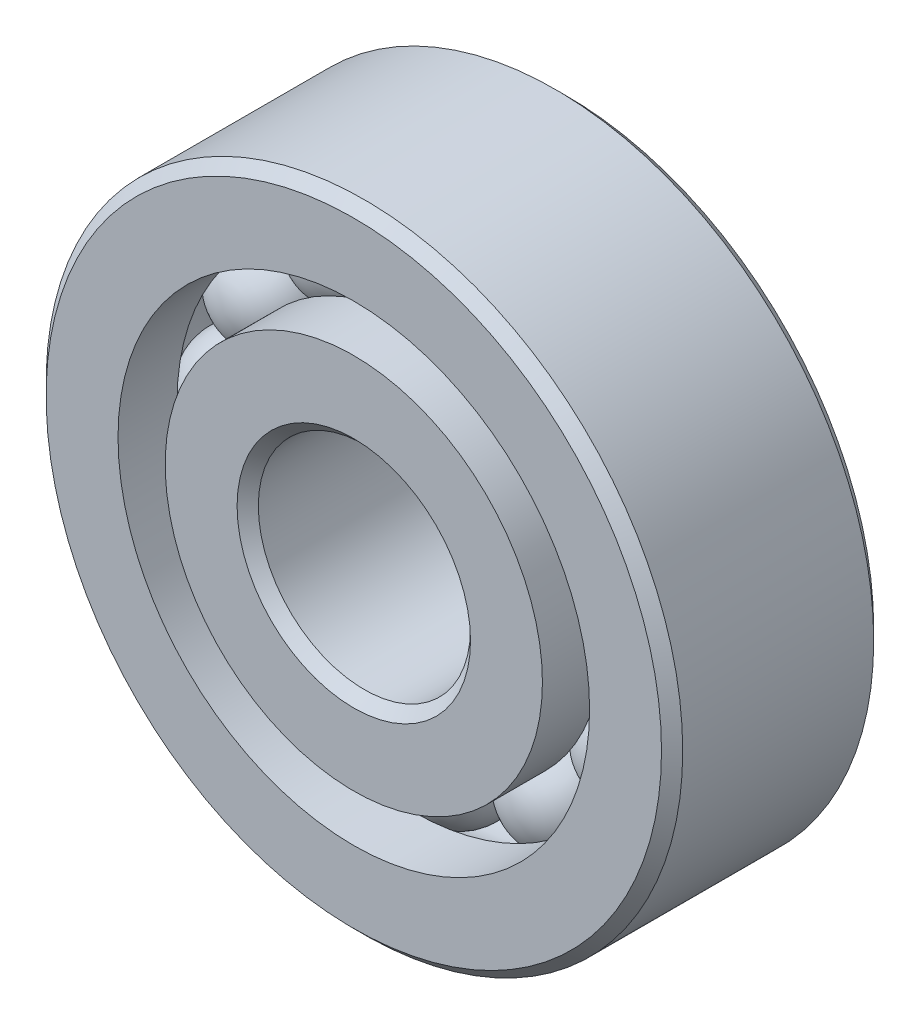
ISO-10303-21;
HEADER;
FILE_DESCRIPTION(('STEP AP214'),'2;1');
FILE_NAME('part.step','',(''),(''),'','','');
FILE_SCHEMA(('AUTOMOTIVE_DESIGN { 1 0 10303 214 1 1 1 1 }'));
ENDSEC;
DATA;
#1=APPLICATION_CONTEXT('core data for automotive mechanical design processes');
#2=APPLICATION_PROTOCOL_DEFINITION('international standard','automotive_design',2000,#1);
#3=PRODUCT_CONTEXT('',#1,'mechanical');
#4=PRODUCT('Part','Part','',(#3));
#5=PRODUCT_RELATED_PRODUCT_CATEGORY('part','',(#4));
#6=PRODUCT_DEFINITION_FORMATION('','',#4);
#7=PRODUCT_DEFINITION_CONTEXT('part definition',#1,'design');
#8=PRODUCT_DEFINITION('design','',#6,#7);
#9=PRODUCT_DEFINITION_SHAPE('','',#8);
#10=(LENGTH_UNIT() NAMED_UNIT(*) SI_UNIT(.MILLI.,.METRE.));
#11=(NAMED_UNIT(*) PLANE_ANGLE_UNIT() SI_UNIT($,.RADIAN.));
#12=(NAMED_UNIT(*) SI_UNIT($,.STERADIAN.) SOLID_ANGLE_UNIT());
#13=UNCERTAINTY_MEASURE_WITH_UNIT(LENGTH_MEASURE(1.E-05),#10,'distance_accuracy_value','');
#14=(GEOMETRIC_REPRESENTATION_CONTEXT(3) GLOBAL_UNCERTAINTY_ASSIGNED_CONTEXT((#13)) GLOBAL_UNIT_ASSIGNED_CONTEXT((#10,
#11,#12)) REPRESENTATION_CONTEXT('',''));
#15=CARTESIAN_POINT('',(0.,0.,0.));
#16=DIRECTION('',(0.,0.,1.));
#17=DIRECTION('',(1.,0.,0.));
#18=AXIS2_PLACEMENT_3D('',#15,#16,#17);
#19=CARTESIAN_POINT('',(-0.499999999999989,0.866025403784445,0.));
#20=DIRECTION('',(0.,0.,1.));
#21=DIRECTION('',(-0.499999999999989,0.866025403784445,0.));
#22=AXIS2_PLACEMENT_3D('',#19,#20,#21);
#23=SPHERICAL_SURFACE('',#22,0.248451997499976);
#24=CARTESIAN_POINT('',(-0.499999999999989,0.866025403784445,0.248451997499976));
#25=VERTEX_POINT('',#24);
#26=VERTEX_LOOP('',#25);
#27=FACE_BOUND('',#26,.T.);
#28=ADVANCED_FACE('F41',(#27),#23,.T.);
#29=CLOSED_SHELL('',(#28));
#30=MANIFOLD_SOLID_BREP('B2',#29);
#31=CARTESIAN_POINT('',(-0.866025403784433,0.50000000000001,0.));
#32=DIRECTION('',(0.,0.,1.));
#33=DIRECTION('',(-0.866025403784433,0.50000000000001,0.));
#34=AXIS2_PLACEMENT_3D('',#31,#32,#33);
#35=SPHERICAL_SURFACE('',#34,0.248451997499976);
#36=CARTESIAN_POINT('',(-0.866025403784433,0.50000000000001,0.248451997499976));
#37=VERTEX_POINT('',#36);
#38=VERTEX_LOOP('',#37);
#39=FACE_BOUND('',#38,.T.);
#40=ADVANCED_FACE('F77',(#39),#35,.T.);
#41=CLOSED_SHELL('',(#40));
#42=MANIFOLD_SOLID_BREP('B6',#41);
#43=CARTESIAN_POINT('',(-1.,0.,0.));
#44=DIRECTION('',(0.,0.,1.));
#45=DIRECTION('',(-1.,0.,0.));
#46=AXIS2_PLACEMENT_3D('',#43,#44,#45);
#47=SPHERICAL_SURFACE('',#46,0.248451997499976);
#48=CARTESIAN_POINT('',(-1.,0.,0.248451997499976));
#49=VERTEX_POINT('',#48);
#50=VERTEX_LOOP('',#49);
#51=FACE_BOUND('',#50,.T.);
#52=ADVANCED_FACE('F113',(#51),#47,.T.);
#53=CLOSED_SHELL('',(#52));
#54=MANIFOLD_SOLID_BREP('B37',#53);
#55=CARTESIAN_POINT('',(-0.866025403784443,-0.499999999999992,0.));
#56=DIRECTION('',(0.,0.,1.));
#57=DIRECTION('',(-0.866025403784443,-0.499999999999992,0.));
#58=AXIS2_PLACEMENT_3D('',#55,#56,#57);
#59=SPHERICAL_SURFACE('',#58,0.248451997499976);
#60=CARTESIAN_POINT('',(-0.866025403784443,-0.499999999999992,0.248451997499976));
#61=VERTEX_POINT('',#60);
#62=VERTEX_LOOP('',#61);
#63=FACE_BOUND('',#62,.T.);
#64=ADVANCED_FACE('F149',(#63),#59,.T.);
#65=CLOSED_SHELL('',(#64));
#66=MANIFOLD_SOLID_BREP('B73',#65);
#67=CARTESIAN_POINT('',(-0.500000000000007,-0.866025403784435,0.));
#68=DIRECTION('',(0.,0.,1.));
#69=DIRECTION('',(-0.500000000000007,-0.866025403784435,0.));
#70=AXIS2_PLACEMENT_3D('',#67,#68,#69);
#71=SPHERICAL_SURFACE('',#70,0.248451997499976);
#72=CARTESIAN_POINT('',(-0.500000000000007,-0.866025403784435,0.248451997499976));
#73=VERTEX_POINT('',#72);
#74=VERTEX_LOOP('',#73);
#75=FACE_BOUND('',#74,.T.);
#76=ADVANCED_FACE('F185',(#75),#71,.T.);
#77=CLOSED_SHELL('',(#76));
#78=MANIFOLD_SOLID_BREP('B109',#77);
#79=CARTESIAN_POINT('',(0.,-1.,0.));
#80=DIRECTION('',(0.,0.,1.));
#81=DIRECTION('',(0.,-1.,0.));
#82=AXIS2_PLACEMENT_3D('',#79,#80,#81);
#83=SPHERICAL_SURFACE('',#82,0.248451997499976);
#84=CARTESIAN_POINT('',(0.,-1.,0.248451997499976));
#85=VERTEX_POINT('',#84);
#86=VERTEX_LOOP('',#85);
#87=FACE_BOUND('',#86,.T.);
#88=ADVANCED_FACE('F221',(#87),#83,.T.);
#89=CLOSED_SHELL('',(#88));
#90=MANIFOLD_SOLID_BREP('B145',#89);
#91=CARTESIAN_POINT('',(0.499999999999995,-0.866025403784442,0.));
#92=DIRECTION('',(0.,0.,1.));
#93=DIRECTION('',(0.499999999999995,-0.866025403784442,0.));
#94=AXIS2_PLACEMENT_3D('',#91,#92,#93);
#95=SPHERICAL_SURFACE('',#94,0.248451997499976);
#96=CARTESIAN_POINT('',(0.499999999999995,-0.866025403784442,0.248451997499976));
#97=VERTEX_POINT('',#96);
#98=VERTEX_LOOP('',#97);
#99=FACE_BOUND('',#98,.T.);
#100=ADVANCED_FACE('F257',(#99),#95,.T.);
#101=CLOSED_SHELL('',(#100));
#102=MANIFOLD_SOLID_BREP('B181',#101);
#103=CARTESIAN_POINT('',(0.866025403784436,-0.500000000000004,0.));
#104=DIRECTION('',(0.,0.,1.));
#105=DIRECTION('',(0.866025403784436,-0.500000000000004,0.));
#106=AXIS2_PLACEMENT_3D('',#103,#104,#105);
#107=SPHERICAL_SURFACE('',#106,0.248451997499976);
#108=CARTESIAN_POINT('',(0.866025403784436,-0.500000000000004,0.248451997499976));
#109=VERTEX_POINT('',#108);
#110=VERTEX_LOOP('',#109);
#111=FACE_BOUND('',#110,.T.);
#112=ADVANCED_FACE('F293',(#111),#107,.T.);
#113=CLOSED_SHELL('',(#112));
#114=MANIFOLD_SOLID_BREP('B217',#113);
#115=CARTESIAN_POINT('',(1.,0.,0.));
#116=DIRECTION('',(0.,0.,1.));
#117=DIRECTION('',(1.,0.,0.));
#118=AXIS2_PLACEMENT_3D('',#115,#116,#117);
#119=SPHERICAL_SURFACE('',#118,0.248451997499976);
#120=CARTESIAN_POINT('',(1.,0.,0.248451997499976));
#121=VERTEX_POINT('',#120);
#122=VERTEX_LOOP('',#121);
#123=FACE_BOUND('',#122,.T.);
#124=ADVANCED_FACE('F329',(#123),#119,.T.);
#125=CLOSED_SHELL('',(#124));
#126=MANIFOLD_SOLID_BREP('B253',#125);
#127=CARTESIAN_POINT('',(0.86602540378444,0.499999999999998,0.));
#128=DIRECTION('',(0.,0.,1.));
#129=DIRECTION('',(0.86602540378444,0.499999999999998,0.));
#130=AXIS2_PLACEMENT_3D('',#127,#128,#129);
#131=SPHERICAL_SURFACE('',#130,0.248451997499976);
#132=CARTESIAN_POINT('',(0.86602540378444,0.499999999999998,0.248451997499976));
#133=VERTEX_POINT('',#132);
#134=VERTEX_LOOP('',#133);
#135=FACE_BOUND('',#134,.T.);
#136=ADVANCED_FACE('F365',(#135),#131,.T.);
#137=CLOSED_SHELL('',(#136));
#138=MANIFOLD_SOLID_BREP('B289',#137);
#139=CARTESIAN_POINT('',(0.500000000000001,0.866025403784438,0.));
#140=DIRECTION('',(0.,0.,1.));
#141=DIRECTION('',(0.500000000000001,0.866025403784438,0.));
#142=AXIS2_PLACEMENT_3D('',#139,#140,#141);
#143=SPHERICAL_SURFACE('',#142,0.248451997499976);
#144=CARTESIAN_POINT('',(0.500000000000001,0.866025403784438,0.248451997499976));
#145=VERTEX_POINT('',#144);
#146=VERTEX_LOOP('',#145);
#147=FACE_BOUND('',#146,.T.);
#148=ADVANCED_FACE('F401',(#147),#143,.T.);
#149=CLOSED_SHELL('',(#148));
#150=MANIFOLD_SOLID_BREP('B325',#149);
#151=CARTESIAN_POINT('',(0.,1.,0.));
#152=DIRECTION('',(0.,0.,1.));
#153=DIRECTION('',(0.,1.,0.));
#154=AXIS2_PLACEMENT_3D('',#151,#152,#153);
#155=SPHERICAL_SURFACE('',#154,0.248451997499976);
#156=CARTESIAN_POINT('',(0.,1.,0.248451997499976));
#157=VERTEX_POINT('',#156);
#158=VERTEX_LOOP('',#157);
#159=FACE_BOUND('',#158,.T.);
#160=ADVANCED_FACE('F439',(#159),#155,.T.);
#161=CLOSED_SHELL('',(#160));
#162=MANIFOLD_SOLID_BREP('B361',#161);
#163=CARTESIAN_POINT('',(0.,0.888888888888889,0.5));
#164=DIRECTION('',(0.,0.,-1.));
#165=DIRECTION('',(-1.,0.,0.));
#166=AXIS2_PLACEMENT_3D('',#163,#164,#165);
#167=PLANE('',#166);
#168=CARTESIAN_POINT('',(0.,0.,0.5));
#169=DIRECTION('',(0.,0.,1.));
#170=DIRECTION('',(1.,0.,0.));
#171=AXIS2_PLACEMENT_3D('',#168,#169,#170);
#172=CIRCLE('',#171,0.55);
#173=CARTESIAN_POINT('',(0.55,0.,0.5));
#174=VERTEX_POINT('',#173);
#175=EDGE_CURVE('E438',#174,#174,#172,.T.);
#176=ORIENTED_EDGE('',*,*,#175,.F.);
#177=EDGE_LOOP('',(#176));
#178=FACE_BOUND('',#177,.T.);
#179=CARTESIAN_POINT('',(0.,0.,0.5));
#180=DIRECTION('',(0.,0.,1.));
#181=DIRECTION('',(1.,0.,0.));
#182=AXIS2_PLACEMENT_3D('',#179,#180,#181);
#183=CIRCLE('',#182,0.888888888888889);
#184=CARTESIAN_POINT('',(0.888888888888889,0.,0.5));
#185=VERTEX_POINT('',#184);
#186=EDGE_CURVE('E486',#185,#185,#183,.T.);
#187=ORIENTED_EDGE('',*,*,#186,.T.);
#188=EDGE_LOOP('',(#187));
#189=FACE_BOUND('',#188,.T.);
#190=ADVANCED_FACE('F458',(#178,#189),#167,.F.);
#191=CARTESIAN_POINT('',(0.,0.,0.5));
#192=DIRECTION('',(0.,0.,1.));
#193=DIRECTION('',(1.,0.,0.));
#194=AXIS2_PLACEMENT_3D('',#191,#192,#193);
#195=CONICAL_SURFACE('',#194,0.55,0.785398163397446);
#196=CARTESIAN_POINT('',(0.,0.,0.45));
#197=DIRECTION('',(0.,0.,1.));
#198=DIRECTION('',(1.,0.,0.));
#199=AXIS2_PLACEMENT_3D('',#196,#197,#198);
#200=CIRCLE('',#199,0.5);
#201=CARTESIAN_POINT('',(0.5,0.,0.45));
#202=VERTEX_POINT('',#201);
#203=EDGE_CURVE('E464',#202,#202,#200,.T.);
#204=ORIENTED_EDGE('',*,*,#203,.F.);
#205=EDGE_LOOP('',(#204));
#206=FACE_BOUND('',#205,.T.);
#207=ORIENTED_EDGE('',*,*,#175,.T.);
#208=EDGE_LOOP('',(#207));
#209=FACE_BOUND('',#208,.T.);
#210=ADVANCED_FACE('F523',(#206,#209),#195,.F.);
#211=CARTESIAN_POINT('',(0.,0.,0.5));
#212=DIRECTION('',(0.,0.,1.));
#213=DIRECTION('',(1.,0.,0.));
#214=AXIS2_PLACEMENT_3D('',#211,#212,#213);
#215=CYLINDRICAL_SURFACE('',#214,0.5);
#216=CARTESIAN_POINT('',(0.,0.,-0.45));
#217=DIRECTION('',(0.,0.,1.));
#218=DIRECTION('',(1.,0.,0.));
#219=AXIS2_PLACEMENT_3D('',#216,#217,#218);
#220=CIRCLE('',#219,0.5);
#221=CARTESIAN_POINT('',(0.5,0.,-0.45));
#222=VERTEX_POINT('',#221);
#223=EDGE_CURVE('E468',#222,#222,#220,.T.);
#224=ORIENTED_EDGE('',*,*,#223,.F.);
#225=EDGE_LOOP('',(#224));
#226=FACE_BOUND('',#225,.T.);
#227=ORIENTED_EDGE('',*,*,#203,.T.);
#228=EDGE_LOOP('',(#227));
#229=FACE_BOUND('',#228,.T.);
#230=ADVANCED_FACE('F518',(#226,#229),#215,.F.);
#231=CARTESIAN_POINT('',(0.,0.,-0.45));
#232=DIRECTION('',(0.,0.,-1.));
#233=DIRECTION('',(-1.,0.,0.));
#234=AXIS2_PLACEMENT_3D('',#231,#232,#233);
#235=CONICAL_SURFACE('',#234,0.5,0.785398163397445);
#236=CARTESIAN_POINT('',(0.,0.,-0.5));
#237=DIRECTION('',(0.,0.,1.));
#238=DIRECTION('',(1.,0.,0.));
#239=AXIS2_PLACEMENT_3D('',#236,#237,#238);
#240=CIRCLE('',#239,0.55);
#241=CARTESIAN_POINT('',(0.55,0.,-0.5));
#242=VERTEX_POINT('',#241);
#243=EDGE_CURVE('E472',#242,#242,#240,.T.);
#244=ORIENTED_EDGE('',*,*,#243,.F.);
#245=EDGE_LOOP('',(#244));
#246=FACE_BOUND('',#245,.T.);
#247=ORIENTED_EDGE('',*,*,#223,.T.);
#248=EDGE_LOOP('',(#247));
#249=FACE_BOUND('',#248,.T.);
#250=ADVANCED_FACE('F512',(#246,#249),#235,.F.);
#251=CARTESIAN_POINT('',(0.,0.88888888888889,-0.5));
#252=DIRECTION('',(0.,0.,1.));
#253=DIRECTION('',(1.,0.,0.));
#254=AXIS2_PLACEMENT_3D('',#251,#252,#253);
#255=PLANE('',#254);
#256=CARTESIAN_POINT('',(0.,0.,-0.5));
#257=DIRECTION('',(0.,0.,1.));
#258=DIRECTION('',(1.,0.,0.));
#259=AXIS2_PLACEMENT_3D('',#256,#257,#258);
#260=CIRCLE('',#259,0.88888888888889);
#261=CARTESIAN_POINT('',(0.88888888888889,0.,-0.5));
#262=VERTEX_POINT('',#261);
#263=EDGE_CURVE('E477',#262,#262,#260,.T.);
#264=ORIENTED_EDGE('',*,*,#263,.F.);
#265=EDGE_LOOP('',(#264));
#266=FACE_BOUND('',#265,.T.);
#267=ORIENTED_EDGE('',*,*,#243,.T.);
#268=EDGE_LOOP('',(#267));
#269=FACE_BOUND('',#268,.T.);
#270=ADVANCED_FACE('F506',(#266,#269),#255,.F.);
#271=CARTESIAN_POINT('',(0.,0.,0.5));
#272=DIRECTION('',(0.,0.,1.));
#273=DIRECTION('',(1.,0.,0.));
#274=AXIS2_PLACEMENT_3D('',#271,#272,#273);
#275=CYLINDRICAL_SURFACE('',#274,0.888888888888889);
#276=CARTESIAN_POINT('',(0.,0.,-0.222222222222222));
#277=DIRECTION('',(0.,0.,1.));
#278=DIRECTION('',(1.,0.,0.));
#279=AXIS2_PLACEMENT_3D('',#276,#277,#278);
#280=CIRCLE('',#279,0.888888888888889);
#281=CARTESIAN_POINT('',(0.888888888888889,0.,-0.222222222222222));
#282=VERTEX_POINT('',#281);
#283=EDGE_CURVE('E480',#282,#282,#280,.T.);
#284=ORIENTED_EDGE('',*,*,#283,.F.);
#285=EDGE_LOOP('',(#284));
#286=FACE_BOUND('',#285,.T.);
#287=ORIENTED_EDGE('',*,*,#263,.T.);
#288=EDGE_LOOP('',(#287));
#289=FACE_BOUND('',#288,.T.);
#290=ADVANCED_FACE('F500',(#286,#289),#275,.T.);
#291=CARTESIAN_POINT('',(0.,0.,0.));
#292=DIRECTION('',(0.,0.,1.));
#293=DIRECTION('',(1.,0.,0.));
#294=AXIS2_PLACEMENT_3D('',#291,#292,#293);
#295=TOROIDAL_SURFACE('',#294,1.,0.248451997499976);
#296=CARTESIAN_POINT('',(0.,0.,0.222222222222222));
#297=DIRECTION('',(0.,0.,1.));
#298=DIRECTION('',(1.,0.,0.));
#299=AXIS2_PLACEMENT_3D('',#296,#297,#298);
#300=CIRCLE('',#299,0.888888888888889);
#301=CARTESIAN_POINT('',(0.888888888888889,0.,0.222222222222222));
#302=VERTEX_POINT('',#301);
#303=EDGE_CURVE('E483',#302,#302,#300,.T.);
#304=ORIENTED_EDGE('',*,*,#303,.F.);
#305=EDGE_LOOP('',(#304));
#306=FACE_BOUND('',#305,.T.);
#307=ORIENTED_EDGE('',*,*,#283,.T.);
#308=EDGE_LOOP('',(#307));
#309=FACE_BOUND('',#308,.T.);
#310=ADVANCED_FACE('F494',(#306,#309),#295,.F.);
#311=CARTESIAN_POINT('',(0.,0.,0.5));
#312=DIRECTION('',(0.,0.,1.));
#313=DIRECTION('',(1.,0.,0.));
#314=AXIS2_PLACEMENT_3D('',#311,#312,#313);
#315=CYLINDRICAL_SURFACE('',#314,0.888888888888889);
#316=ORIENTED_EDGE('',*,*,#186,.F.);
#317=EDGE_LOOP('',(#316));
#318=FACE_BOUND('',#317,.T.);
#319=ORIENTED_EDGE('',*,*,#303,.T.);
#320=EDGE_LOOP('',(#319));
#321=FACE_BOUND('',#320,.T.);
#322=ADVANCED_FACE('F491',(#318,#321),#315,.T.);
#323=CLOSED_SHELL('',(#190,#210,#230,#250,#270,#290,#310,#322));
#324=MANIFOLD_SOLID_BREP('B397',#323);
#325=CARTESIAN_POINT('',(0.,0.,0.45));
#326=DIRECTION('',(0.,0.,-1.));
#327=DIRECTION('',(-1.,0.,0.));
#328=AXIS2_PLACEMENT_3D('',#325,#326,#327);
#329=CONICAL_SURFACE('',#328,1.5,0.785398163397446);
#330=CARTESIAN_POINT('',(0.,0.,0.5));
#331=DIRECTION('',(0.,0.,1.));
#332=DIRECTION('',(1.,0.,0.));
#333=AXIS2_PLACEMENT_3D('',#330,#331,#332);
#334=CIRCLE('',#333,1.45);
#335=CARTESIAN_POINT('',(1.45,0.,0.5));
#336=VERTEX_POINT('',#335);
#337=EDGE_CURVE('E607',#336,#336,#334,.T.);
#338=ORIENTED_EDGE('',*,*,#337,.F.);
#339=EDGE_LOOP('',(#338));
#340=FACE_BOUND('',#339,.T.);
#341=CARTESIAN_POINT('',(0.,0.,0.45));
#342=DIRECTION('',(0.,0.,1.));
#343=DIRECTION('',(1.,0.,0.));
#344=AXIS2_PLACEMENT_3D('',#341,#342,#343);
#345=CIRCLE('',#344,1.5);
#346=CARTESIAN_POINT('',(1.5,0.,0.45));
#347=VERTEX_POINT('',#346);
#348=EDGE_CURVE('E457',#347,#347,#345,.T.);
#349=ORIENTED_EDGE('',*,*,#348,.T.);
#350=EDGE_LOOP('',(#349));
#351=FACE_BOUND('',#350,.T.);
#352=ADVANCED_FACE('F579',(#340,#351),#329,.T.);
#353=CARTESIAN_POINT('',(0.,0.,0.5));
#354=DIRECTION('',(0.,0.,1.));
#355=DIRECTION('',(1.,0.,0.));
#356=AXIS2_PLACEMENT_3D('',#353,#354,#355);
#357=CYLINDRICAL_SURFACE('',#356,1.5);
#358=ORIENTED_EDGE('',*,*,#348,.F.);
#359=EDGE_LOOP('',(#358));
#360=FACE_BOUND('',#359,.T.);
#361=CARTESIAN_POINT('',(0.,0.,-0.450000000000001));
#362=DIRECTION('',(0.,0.,1.));
#363=DIRECTION('',(1.,0.,0.));
#364=AXIS2_PLACEMENT_3D('',#361,#362,#363);
#365=CIRCLE('',#364,1.5);
#366=CARTESIAN_POINT('',(1.5,0.,-0.450000000000001));
#367=VERTEX_POINT('',#366);
#368=EDGE_CURVE('E585',#367,#367,#365,.T.);
#369=ORIENTED_EDGE('',*,*,#368,.T.);
#370=EDGE_LOOP('',(#369));
#371=FACE_BOUND('',#370,.T.);
#372=ADVANCED_FACE('F614',(#360,#371),#357,.T.);
#373=CARTESIAN_POINT('',(0.,0.,-0.500000000000001));
#374=DIRECTION('',(0.,0.,1.));
#375=DIRECTION('',(1.,0.,0.));
#376=AXIS2_PLACEMENT_3D('',#373,#374,#375);
#377=CONICAL_SURFACE('',#376,1.45,0.785398163397445);
#378=ORIENTED_EDGE('',*,*,#368,.F.);
#379=EDGE_LOOP('',(#378));
#380=FACE_BOUND('',#379,.T.);
#381=CARTESIAN_POINT('',(0.,0.,-0.500000000000001));
#382=DIRECTION('',(0.,0.,1.));
#383=DIRECTION('',(1.,0.,0.));
#384=AXIS2_PLACEMENT_3D('',#381,#382,#383);
#385=CIRCLE('',#384,1.45);
#386=CARTESIAN_POINT('',(1.45,0.,-0.500000000000001));
#387=VERTEX_POINT('',#386);
#388=EDGE_CURVE('E589',#387,#387,#385,.T.);
#389=ORIENTED_EDGE('',*,*,#388,.T.);
#390=EDGE_LOOP('',(#389));
#391=FACE_BOUND('',#390,.T.);
#392=ADVANCED_FACE('F618',(#380,#391),#377,.T.);
#393=CARTESIAN_POINT('',(0.,1.45,-0.500000000000001));
#394=DIRECTION('',(0.,0.,1.));
#395=DIRECTION('',(1.,0.,0.));
#396=AXIS2_PLACEMENT_3D('',#393,#394,#395);
#397=PLANE('',#396);
#398=ORIENTED_EDGE('',*,*,#388,.F.);
#399=EDGE_LOOP('',(#398));
#400=FACE_BOUND('',#399,.T.);
#401=CARTESIAN_POINT('',(0.,0.,-0.500000000000001));
#402=DIRECTION('',(0.,0.,1.));
#403=DIRECTION('',(1.,0.,0.));
#404=AXIS2_PLACEMENT_3D('',#401,#402,#403);
#405=CIRCLE('',#404,1.11111111111111);
#406=CARTESIAN_POINT('',(1.11111111111111,0.,-0.500000000000001));
#407=VERTEX_POINT('',#406);
#408=EDGE_CURVE('E593',#407,#407,#405,.T.);
#409=ORIENTED_EDGE('',*,*,#408,.T.);
#410=EDGE_LOOP('',(#409));
#411=FACE_BOUND('',#410,.T.);
#412=ADVANCED_FACE('F623',(#400,#411),#397,.F.);
#413=CARTESIAN_POINT('',(0.,0.,0.5));
#414=DIRECTION('',(0.,0.,1.));
#415=DIRECTION('',(1.,0.,0.));
#416=AXIS2_PLACEMENT_3D('',#413,#414,#415);
#417=CYLINDRICAL_SURFACE('',#416,1.11111111111111);
#418=ORIENTED_EDGE('',*,*,#408,.F.);
#419=EDGE_LOOP('',(#418));
#420=FACE_BOUND('',#419,.T.);
#421=CARTESIAN_POINT('',(0.,0.,-0.222222222222222));
#422=DIRECTION('',(0.,0.,1.));
#423=DIRECTION('',(1.,0.,0.));
#424=AXIS2_PLACEMENT_3D('',#421,#422,#423);
#425=CIRCLE('',#424,1.11111111111111);
#426=CARTESIAN_POINT('',(1.11111111111111,0.,-0.222222222222222));
#427=VERTEX_POINT('',#426);
#428=EDGE_CURVE('E598',#427,#427,#425,.T.);
#429=ORIENTED_EDGE('',*,*,#428,.T.);
#430=EDGE_LOOP('',(#429));
#431=FACE_BOUND('',#430,.T.);
#432=ADVANCED_FACE('F629',(#420,#431),#417,.F.);
#433=CARTESIAN_POINT('',(0.,0.,0.));
#434=DIRECTION('',(0.,0.,1.));
#435=DIRECTION('',(1.,0.,0.));
#436=AXIS2_PLACEMENT_3D('',#433,#434,#435);
#437=TOROIDAL_SURFACE('',#436,1.,0.248451997499976);
#438=ORIENTED_EDGE('',*,*,#428,.F.);
#439=EDGE_LOOP('',(#438));
#440=FACE_BOUND('',#439,.T.);
#441=CARTESIAN_POINT('',(0.,0.,0.222222222222222));
#442=DIRECTION('',(0.,0.,1.));
#443=DIRECTION('',(1.,0.,0.));
#444=AXIS2_PLACEMENT_3D('',#441,#442,#443);
#445=CIRCLE('',#444,1.11111111111111);
#446=CARTESIAN_POINT('',(1.11111111111111,0.,0.222222222222222));
#447=VERTEX_POINT('',#446);
#448=EDGE_CURVE('E601',#447,#447,#445,.T.);
#449=ORIENTED_EDGE('',*,*,#448,.T.);
#450=EDGE_LOOP('',(#449));
#451=FACE_BOUND('',#450,.T.);
#452=ADVANCED_FACE('F633',(#440,#451),#437,.F.);
#453=CARTESIAN_POINT('',(0.,0.,0.5));
#454=DIRECTION('',(0.,0.,1.));
#455=DIRECTION('',(1.,0.,0.));
#456=AXIS2_PLACEMENT_3D('',#453,#454,#455);
#457=CYLINDRICAL_SURFACE('',#456,1.11111111111111);
#458=ORIENTED_EDGE('',*,*,#448,.F.);
#459=EDGE_LOOP('',(#458));
#460=FACE_BOUND('',#459,.T.);
#461=CARTESIAN_POINT('',(0.,0.,0.5));
#462=DIRECTION('',(0.,0.,1.));
#463=DIRECTION('',(1.,0.,0.));
#464=AXIS2_PLACEMENT_3D('',#461,#462,#463);
#465=CIRCLE('',#464,1.11111111111111);
#466=CARTESIAN_POINT('',(1.11111111111111,0.,0.5));
#467=VERTEX_POINT('',#466);
#468=EDGE_CURVE('E604',#467,#467,#465,.T.);
#469=ORIENTED_EDGE('',*,*,#468,.T.);
#470=EDGE_LOOP('',(#469));
#471=FACE_BOUND('',#470,.T.);
#472=ADVANCED_FACE('F637',(#460,#471),#457,.F.);
#473=CARTESIAN_POINT('',(0.,1.45,0.5));
#474=DIRECTION('',(0.,0.,-1.));
#475=DIRECTION('',(-1.,0.,0.));
#476=AXIS2_PLACEMENT_3D('',#473,#474,#475);
#477=PLANE('',#476);
#478=ORIENTED_EDGE('',*,*,#468,.F.);
#479=EDGE_LOOP('',(#478));
#480=FACE_BOUND('',#479,.T.);
#481=ORIENTED_EDGE('',*,*,#337,.T.);
#482=EDGE_LOOP('',(#481));
#483=FACE_BOUND('',#482,.T.);
#484=ADVANCED_FACE('F611',(#480,#483),#477,.F.);
#485=CLOSED_SHELL('',(#352,#372,#392,#412,#432,#452,#472,#484));
#486=MANIFOLD_SOLID_BREP('B433',#485);
#487=ADVANCED_BREP_SHAPE_REPRESENTATION('',(#18,#30,#42,#54,#66,#78,#90,#102,#114,#126,#138,
#150,#162,#324,#486),#14);
#488=SHAPE_DEFINITION_REPRESENTATION(#9,#487);
ENDSEC;
END-ISO-10303-21;
